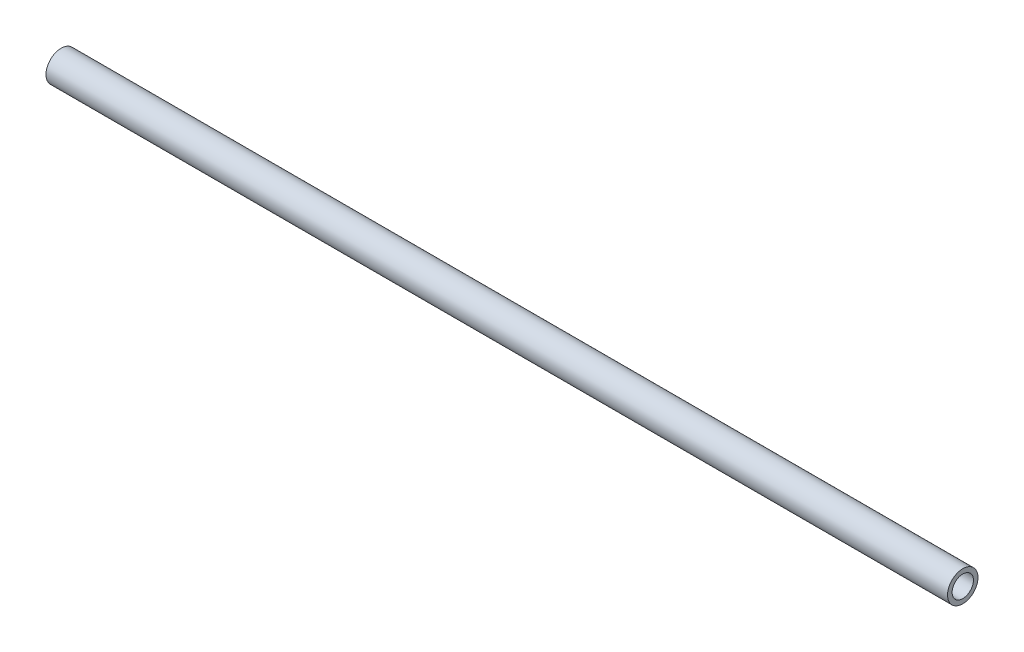
ISO-10303-21;
HEADER;
FILE_DESCRIPTION(('STEP AP214'),'2;1');
FILE_NAME('part.step','',(''),(''),'','','');
FILE_SCHEMA(('AUTOMOTIVE_DESIGN { 1 0 10303 214 1 1 1 1 }'));
ENDSEC;
DATA;
#1=APPLICATION_CONTEXT('core data for automotive mechanical design processes');
#2=APPLICATION_PROTOCOL_DEFINITION('international standard','automotive_design',2000,#1);
#3=PRODUCT_CONTEXT('',#1,'mechanical');
#4=PRODUCT('Part','Part','',(#3));
#5=PRODUCT_RELATED_PRODUCT_CATEGORY('part','',(#4));
#6=PRODUCT_DEFINITION_FORMATION('','',#4);
#7=PRODUCT_DEFINITION_CONTEXT('part definition',#1,'design');
#8=PRODUCT_DEFINITION('design','',#6,#7);
#9=PRODUCT_DEFINITION_SHAPE('','',#8);
#10=(LENGTH_UNIT() NAMED_UNIT(*) SI_UNIT(.MILLI.,.METRE.));
#11=(NAMED_UNIT(*) PLANE_ANGLE_UNIT() SI_UNIT($,.RADIAN.));
#12=(NAMED_UNIT(*) SI_UNIT($,.STERADIAN.) SOLID_ANGLE_UNIT());
#13=UNCERTAINTY_MEASURE_WITH_UNIT(LENGTH_MEASURE(1.E-05),#10,'distance_accuracy_value','');
#14=(GEOMETRIC_REPRESENTATION_CONTEXT(3) GLOBAL_UNCERTAINTY_ASSIGNED_CONTEXT((#13)) GLOBAL_UNIT_ASSIGNED_CONTEXT((#10,
#11,#12)) REPRESENTATION_CONTEXT('',''));
#15=CARTESIAN_POINT('',(0.,0.,0.));
#16=DIRECTION('',(0.,0.,1.));
#17=DIRECTION('',(1.,0.,0.));
#18=AXIS2_PLACEMENT_3D('',#15,#16,#17);
#19=CARTESIAN_POINT('',(939.8,0.,0.));
#20=DIRECTION('',(1.,0.,0.));
#21=DIRECTION('',(0.,0.,-1.));
#22=AXIS2_PLACEMENT_3D('',#19,#20,#21);
#23=PLANE('',#22);
#24=CARTESIAN_POINT('',(939.8,0.,0.));
#25=DIRECTION('',(1.,0.,0.));
#26=DIRECTION('',(0.,0.,-1.));
#27=AXIS2_PLACEMENT_3D('',#24,#25,#26);
#28=CIRCLE('',#27,15.875);
#29=CARTESIAN_POINT('',(939.8,0.,-15.875));
#30=VERTEX_POINT('',#29);
#31=EDGE_CURVE('E10',#30,#30,#28,.T.);
#32=ORIENTED_EDGE('',*,*,#31,.T.);
#33=EDGE_LOOP('',(#32));
#34=FACE_BOUND('',#33,.T.);
#35=CARTESIAN_POINT('',(939.8,0.,0.));
#36=DIRECTION('',(1.,0.,0.));
#37=DIRECTION('',(0.,0.,-1.));
#38=AXIS2_PLACEMENT_3D('',#35,#36,#37);
#39=CIRCLE('',#38,11.1125);
#40=CARTESIAN_POINT('',(939.8,0.,-11.1125));
#41=VERTEX_POINT('',#40);
#42=EDGE_CURVE('E42',#41,#41,#39,.T.);
#43=ORIENTED_EDGE('',*,*,#42,.F.);
#44=EDGE_LOOP('',(#43));
#45=FACE_BOUND('',#44,.T.);
#46=ADVANCED_FACE('F31',(#34,#45),#23,.T.);
#47=CARTESIAN_POINT('',(0.,0.,0.));
#48=DIRECTION('',(1.,0.,0.));
#49=DIRECTION('',(0.,0.,-1.));
#50=AXIS2_PLACEMENT_3D('',#47,#48,#49);
#51=PLANE('',#50);
#52=CARTESIAN_POINT('',(0.,0.,0.));
#53=DIRECTION('',(1.,0.,0.));
#54=DIRECTION('',(0.,0.,-1.));
#55=AXIS2_PLACEMENT_3D('',#52,#53,#54);
#56=CIRCLE('',#55,15.875);
#57=CARTESIAN_POINT('',(0.,0.,-15.875));
#58=VERTEX_POINT('',#57);
#59=EDGE_CURVE('E35',#58,#58,#56,.T.);
#60=ORIENTED_EDGE('',*,*,#59,.F.);
#61=EDGE_LOOP('',(#60));
#62=FACE_BOUND('',#61,.T.);
#63=CARTESIAN_POINT('',(0.,0.,0.));
#64=DIRECTION('',(1.,0.,0.));
#65=DIRECTION('',(0.,0.,-1.));
#66=AXIS2_PLACEMENT_3D('',#63,#64,#65);
#67=CIRCLE('',#66,11.1125);
#68=CARTESIAN_POINT('',(0.,0.,-11.1125));
#69=VERTEX_POINT('',#68);
#70=EDGE_CURVE('E44',#69,#69,#67,.T.);
#71=ORIENTED_EDGE('',*,*,#70,.T.);
#72=EDGE_LOOP('',(#71));
#73=FACE_BOUND('',#72,.T.);
#74=ADVANCED_FACE('F54',(#62,#73),#51,.F.);
#75=CARTESIAN_POINT('',(939.8,0.,0.));
#76=DIRECTION('',(-1.,0.,0.));
#77=DIRECTION('',(0.,0.,1.));
#78=AXIS2_PLACEMENT_3D('',#75,#76,#77);
#79=CYLINDRICAL_SURFACE('',#78,15.875);
#80=ORIENTED_EDGE('',*,*,#31,.F.);
#81=EDGE_LOOP('',(#80));
#82=FACE_BOUND('',#81,.T.);
#83=ORIENTED_EDGE('',*,*,#59,.T.);
#84=EDGE_LOOP('',(#83));
#85=FACE_BOUND('',#84,.T.);
#86=ADVANCED_FACE('F33',(#82,#85),#79,.T.);
#87=CARTESIAN_POINT('',(939.8,0.,0.));
#88=DIRECTION('',(-1.,0.,0.));
#89=DIRECTION('',(0.,0.,1.));
#90=AXIS2_PLACEMENT_3D('',#87,#88,#89);
#91=CYLINDRICAL_SURFACE('',#90,11.1125);
#92=ORIENTED_EDGE('',*,*,#42,.T.);
#93=EDGE_LOOP('',(#92));
#94=FACE_BOUND('',#93,.T.);
#95=ORIENTED_EDGE('',*,*,#70,.F.);
#96=EDGE_LOOP('',(#95));
#97=FACE_BOUND('',#96,.T.);
#98=ADVANCED_FACE('F50',(#94,#97),#91,.F.);
#99=CLOSED_SHELL('',(#46,#74,#86,#98));
#100=MANIFOLD_SOLID_BREP('B2',#99);
#101=ADVANCED_BREP_SHAPE_REPRESENTATION('',(#18,#100),#14);
#102=SHAPE_DEFINITION_REPRESENTATION(#9,#101);
ENDSEC;
END-ISO-10303-21;
